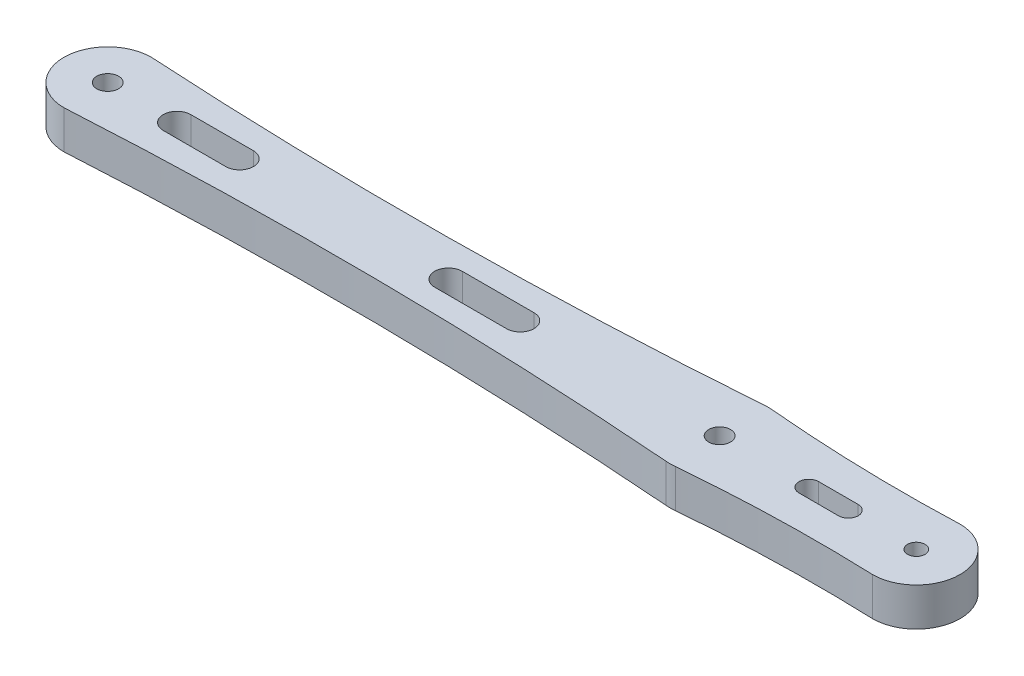
ISO-10303-21;
HEADER;
FILE_DESCRIPTION(('STEP AP214'),'2;1');
FILE_NAME('part.step','',(''),(''),'','','');
FILE_SCHEMA(('AUTOMOTIVE_DESIGN { 1 0 10303 214 1 1 1 1 }'));
ENDSEC;
DATA;
#1=APPLICATION_CONTEXT('core data for automotive mechanical design processes');
#2=APPLICATION_PROTOCOL_DEFINITION('international standard','automotive_design',2000,#1);
#3=PRODUCT_CONTEXT('',#1,'mechanical');
#4=PRODUCT('Part','Part','',(#3));
#5=PRODUCT_RELATED_PRODUCT_CATEGORY('part','',(#4));
#6=PRODUCT_DEFINITION_FORMATION('','',#4);
#7=PRODUCT_DEFINITION_CONTEXT('part definition',#1,'design');
#8=PRODUCT_DEFINITION('design','',#6,#7);
#9=PRODUCT_DEFINITION_SHAPE('','',#8);
#10=(LENGTH_UNIT() NAMED_UNIT(*) SI_UNIT(.MILLI.,.METRE.));
#11=(NAMED_UNIT(*) PLANE_ANGLE_UNIT() SI_UNIT($,.RADIAN.));
#12=(NAMED_UNIT(*) SI_UNIT($,.STERADIAN.) SOLID_ANGLE_UNIT());
#13=UNCERTAINTY_MEASURE_WITH_UNIT(LENGTH_MEASURE(1.E-05),#10,'distance_accuracy_value','');
#14=(GEOMETRIC_REPRESENTATION_CONTEXT(3) GLOBAL_UNCERTAINTY_ASSIGNED_CONTEXT((#13)) GLOBAL_UNIT_ASSIGNED_CONTEXT((#10,
#11,#12)) REPRESENTATION_CONTEXT('',''));
#15=CARTESIAN_POINT('',(0.,0.,0.));
#16=DIRECTION('',(0.,0.,1.));
#17=DIRECTION('',(1.,0.,0.));
#18=AXIS2_PLACEMENT_3D('',#15,#16,#17);
#19=CARTESIAN_POINT('',(36.,7.,0.));
#20=DIRECTION('',(0.,-1.,0.));
#21=DIRECTION('',(0.,0.,-1.));
#22=AXIS2_PLACEMENT_3D('',#19,#20,#21);
#23=CYLINDRICAL_SURFACE('',#22,8.);
#24=CARTESIAN_POINT('',(36.,0.,0.));
#25=DIRECTION('',(0.,1.,0.));
#26=DIRECTION('',(0.,0.,1.));
#27=AXIS2_PLACEMENT_3D('',#24,#25,#26);
#28=CIRCLE('',#27,8.);
#29=CARTESIAN_POINT('',(35.9999999999993,0.,8.));
#30=VERTEX_POINT('',#29);
#31=CARTESIAN_POINT('',(35.9999999999993,0.,-8.));
#32=VERTEX_POINT('',#31);
#33=EDGE_CURVE('E225',#30,#32,#28,.T.);
#34=ORIENTED_EDGE('',*,*,#33,.T.);
#35=DIRECTION('',(0.,-1.,0.));
#36=VECTOR('',#35,1.);
#37=CARTESIAN_POINT('',(35.9999999999993,7.,-8.));
#38=LINE('',#37,#36);
#39=CARTESIAN_POINT('',(35.9999999999993,7.,-8.));
#40=VERTEX_POINT('',#39);
#41=EDGE_CURVE('E392',#40,#32,#38,.T.);
#42=ORIENTED_EDGE('',*,*,#41,.F.);
#43=CARTESIAN_POINT('',(36.,7.,0.));
#44=DIRECTION('',(0.,1.,0.));
#45=DIRECTION('',(0.,0.,1.));
#46=AXIS2_PLACEMENT_3D('',#43,#44,#45);
#47=CIRCLE('',#46,8.);
#48=CARTESIAN_POINT('',(35.9999999999993,7.,8.));
#49=VERTEX_POINT('',#48);
#50=EDGE_CURVE('E316',#49,#40,#47,.T.);
#51=ORIENTED_EDGE('',*,*,#50,.F.);
#52=DIRECTION('',(0.,-1.,0.));
#53=VECTOR('',#52,1.);
#54=CARTESIAN_POINT('',(35.9999999999993,7.,8.));
#55=LINE('',#54,#53);
#56=EDGE_CURVE('E350',#49,#30,#55,.T.);
#57=ORIENTED_EDGE('',*,*,#56,.T.);
#58=EDGE_LOOP('',(#34,#42,#51,#57));
#59=FACE_BOUND('',#58,.T.);
#60=ADVANCED_FACE('F41',(#59),#23,.T.);
#61=CARTESIAN_POINT('',(25.6436822100264,7.,-283.672559560951));
#62=DIRECTION('',(0.,-1.,0.));
#63=DIRECTION('',(0.,0.,-1.));
#64=AXIS2_PLACEMENT_3D('',#61,#62,#63);
#65=CYLINDRICAL_SURFACE('',#64,275.867021249466);
#66=CARTESIAN_POINT('',(25.6436822100264,0.,-283.672559560951));
#67=DIRECTION('',(0.,1.,0.));
#68=DIRECTION('',(0.,0.,1.));
#69=AXIS2_PLACEMENT_3D('',#66,#67,#68);
#70=CIRCLE('',#69,275.867021249466);
#71=CARTESIAN_POINT('',(0.822811591801538,0.,-8.92442436290031));
#72=VERTEX_POINT('',#71);
#73=EDGE_CURVE('E354',#72,#32,#70,.T.);
#74=ORIENTED_EDGE('',*,*,#73,.F.);
#75=DIRECTION('',(0.,-1.,0.));
#76=VECTOR('',#75,1.);
#77=CARTESIAN_POINT('',(0.822811591801538,7.,-8.92442436290031));
#78=LINE('',#77,#76);
#79=CARTESIAN_POINT('',(0.822811591801538,7.,-8.92442436290031));
#80=VERTEX_POINT('',#79);
#81=EDGE_CURVE('E11',#72,#80,#78,.F.);
#82=ORIENTED_EDGE('',*,*,#81,.T.);
#83=CARTESIAN_POINT('',(25.6436822100264,7.,-283.672559560951));
#84=DIRECTION('',(0.,1.,0.));
#85=DIRECTION('',(0.,0.,1.));
#86=AXIS2_PLACEMENT_3D('',#83,#84,#85);
#87=CIRCLE('',#86,275.867021249466);
#88=EDGE_CURVE('E320',#80,#40,#87,.T.);
#89=ORIENTED_EDGE('',*,*,#88,.T.);
#90=ORIENTED_EDGE('',*,*,#41,.T.);
#91=EDGE_LOOP('',(#74,#82,#89,#90));
#92=FACE_BOUND('',#91,.T.);
#93=ADVANCED_FACE('F455',(#92),#65,.F.);
#94=CARTESIAN_POINT('',(-63.3603355622183,7.,-832.857582968458));
#95=DIRECTION('',(0.,-1.,0.));
#96=DIRECTION('',(0.,0.,-1.));
#97=AXIS2_PLACEMENT_3D('',#94,#95,#96);
#98=CYLINDRICAL_SURFACE('',#97,826.290414525781);
#99=CARTESIAN_POINT('',(-63.3603355622183,7.,-832.857582968458));
#100=DIRECTION('',(0.,1.,0.));
#101=DIRECTION('',(0.,0.,1.));
#102=AXIS2_PLACEMENT_3D('',#99,#100,#101);
#103=CIRCLE('',#102,826.290414525781);
#104=CARTESIAN_POINT('',(-111.999999999998,7.,-8.00000000000001));
#105=VERTEX_POINT('',#104);
#106=CARTESIAN_POINT('',(-0.833644493261315,7.,-8.93631121905491));
#107=VERTEX_POINT('',#106);
#108=EDGE_CURVE('E324',#105,#107,#103,.T.);
#109=ORIENTED_EDGE('',*,*,#108,.T.);
#110=DIRECTION('',(0.,-1.,0.));
#111=VECTOR('',#110,1.);
#112=CARTESIAN_POINT('',(-0.833644493261315,7.,-8.93631121905491));
#113=LINE('',#112,#111);
#114=CARTESIAN_POINT('',(-0.833644493261315,0.,-8.93631121905491));
#115=VERTEX_POINT('',#114);
#116=EDGE_CURVE('E50',#107,#115,#113,.T.);
#117=ORIENTED_EDGE('',*,*,#116,.T.);
#118=CARTESIAN_POINT('',(-63.3603355622183,0.,-832.857582968458));
#119=DIRECTION('',(0.,1.,0.));
#120=DIRECTION('',(0.,0.,1.));
#121=AXIS2_PLACEMENT_3D('',#118,#119,#120);
#122=CIRCLE('',#121,826.290414525781);
#123=CARTESIAN_POINT('',(-111.999999999998,0.,-8.00000000000001));
#124=VERTEX_POINT('',#123);
#125=EDGE_CURVE('E357',#124,#115,#122,.T.);
#126=ORIENTED_EDGE('',*,*,#125,.F.);
#127=DIRECTION('',(0.,-1.,0.));
#128=VECTOR('',#127,1.);
#129=CARTESIAN_POINT('',(-111.999999999998,7.,-8.00000000000001));
#130=LINE('',#129,#128);
#131=EDGE_CURVE('E389',#105,#124,#130,.T.);
#132=ORIENTED_EDGE('',*,*,#131,.F.);
#133=EDGE_LOOP('',(#109,#117,#126,#132));
#134=FACE_BOUND('',#133,.T.);
#135=ADVANCED_FACE('F419',(#134),#98,.F.);
#136=CARTESIAN_POINT('',(-112.,7.,0.));
#137=DIRECTION('',(0.,-1.,0.));
#138=DIRECTION('',(0.,0.,-1.));
#139=AXIS2_PLACEMENT_3D('',#136,#137,#138);
#140=CYLINDRICAL_SURFACE('',#139,8.00000000000001);
#141=CARTESIAN_POINT('',(-112.,0.,0.));
#142=DIRECTION('',(0.,1.,0.));
#143=DIRECTION('',(0.,0.,1.));
#144=AXIS2_PLACEMENT_3D('',#141,#142,#143);
#145=CIRCLE('',#144,8.00000000000001);
#146=CARTESIAN_POINT('',(-111.999999999998,0.,8.00000000000001));
#147=VERTEX_POINT('',#146);
#148=EDGE_CURVE('E361',#124,#147,#145,.T.);
#149=ORIENTED_EDGE('',*,*,#148,.T.);
#150=DIRECTION('',(0.,-1.,0.));
#151=VECTOR('',#150,1.);
#152=CARTESIAN_POINT('',(-111.999999999998,7.,8.00000000000001));
#153=LINE('',#152,#151);
#154=CARTESIAN_POINT('',(-111.999999999998,7.,8.00000000000001));
#155=VERTEX_POINT('',#154);
#156=EDGE_CURVE('E385',#155,#147,#153,.T.);
#157=ORIENTED_EDGE('',*,*,#156,.F.);
#158=CARTESIAN_POINT('',(-112.,7.,0.));
#159=DIRECTION('',(0.,1.,0.));
#160=DIRECTION('',(0.,0.,1.));
#161=AXIS2_PLACEMENT_3D('',#158,#159,#160);
#162=CIRCLE('',#161,8.00000000000001);
#163=EDGE_CURVE('E328',#105,#155,#162,.T.);
#164=ORIENTED_EDGE('',*,*,#163,.F.);
#165=ORIENTED_EDGE('',*,*,#131,.T.);
#166=EDGE_LOOP('',(#149,#157,#164,#165));
#167=FACE_BOUND('',#166,.T.);
#168=ADVANCED_FACE('F431',(#167),#140,.T.);
#169=CARTESIAN_POINT('',(-63.3603355622183,7.,832.857582968458));
#170=DIRECTION('',(0.,-1.,0.));
#171=DIRECTION('',(0.,0.,-1.));
#172=AXIS2_PLACEMENT_3D('',#169,#170,#171);
#173=CYLINDRICAL_SURFACE('',#172,826.290414525781);
#174=CARTESIAN_POINT('',(-63.3603355622183,0.,832.857582968458));
#175=DIRECTION('',(0.,1.,0.));
#176=DIRECTION('',(0.,0.,1.));
#177=AXIS2_PLACEMENT_3D('',#174,#175,#176);
#178=CIRCLE('',#177,826.290414525781);
#179=CARTESIAN_POINT('',(-0.833644493261787,0.,8.93631121905491));
#180=VERTEX_POINT('',#179);
#181=EDGE_CURVE('E364',#147,#180,#178,.F.);
#182=ORIENTED_EDGE('',*,*,#181,.T.);
#183=DIRECTION('',(0.,-1.,0.));
#184=VECTOR('',#183,1.);
#185=CARTESIAN_POINT('',(-0.833644493261787,7.,8.93631121905491));
#186=LINE('',#185,#184);
#187=CARTESIAN_POINT('',(-0.833644493261787,7.,8.93631121905491));
#188=VERTEX_POINT('',#187);
#189=EDGE_CURVE('E406',#180,#188,#186,.F.);
#190=ORIENTED_EDGE('',*,*,#189,.T.);
#191=CARTESIAN_POINT('',(-63.3603355622183,7.,832.857582968458));
#192=DIRECTION('',(0.,1.,0.));
#193=DIRECTION('',(0.,0.,1.));
#194=AXIS2_PLACEMENT_3D('',#191,#192,#193);
#195=CIRCLE('',#194,826.290414525781);
#196=EDGE_CURVE('E331',#155,#188,#195,.F.);
#197=ORIENTED_EDGE('',*,*,#196,.F.);
#198=ORIENTED_EDGE('',*,*,#156,.T.);
#199=EDGE_LOOP('',(#182,#190,#197,#198));
#200=FACE_BOUND('',#199,.T.);
#201=ADVANCED_FACE('F435',(#200),#173,.F.);
#202=CARTESIAN_POINT('',(-112.,7.,0.));
#203=DIRECTION('',(0.,-1.,0.));
#204=DIRECTION('',(0.,0.,-1.));
#205=AXIS2_PLACEMENT_3D('',#202,#203,#204);
#206=CYLINDRICAL_SURFACE('',#205,2.);
#207=CARTESIAN_POINT('',(-112.,7.,0.));
#208=DIRECTION('',(0.,1.,0.));
#209=DIRECTION('',(0.,0.,1.));
#210=AXIS2_PLACEMENT_3D('',#207,#208,#209);
#211=CIRCLE('',#210,2.);
#212=CARTESIAN_POINT('',(-112.,7.,2.));
#213=VERTEX_POINT('',#212);
#214=EDGE_CURVE('E342',#213,#213,#211,.T.);
#215=ORIENTED_EDGE('',*,*,#214,.T.);
#216=EDGE_LOOP('',(#215));
#217=FACE_BOUND('',#216,.T.);
#218=CARTESIAN_POINT('',(-112.,0.,0.));
#219=DIRECTION('',(0.,1.,0.));
#220=DIRECTION('',(0.,0.,1.));
#221=AXIS2_PLACEMENT_3D('',#218,#219,#220);
#222=CIRCLE('',#221,2.);
#223=CARTESIAN_POINT('',(-112.,0.,2.));
#224=VERTEX_POINT('',#223);
#225=EDGE_CURVE('E375',#224,#224,#222,.T.);
#226=ORIENTED_EDGE('',*,*,#225,.F.);
#227=EDGE_LOOP('',(#226));
#228=FACE_BOUND('',#227,.T.);
#229=ADVANCED_FACE('F483',(#217,#228),#206,.F.);
#230=CARTESIAN_POINT('',(0.,7.,0.));
#231=DIRECTION('',(0.,-1.,0.));
#232=DIRECTION('',(0.,0.,-1.));
#233=AXIS2_PLACEMENT_3D('',#230,#231,#232);
#234=CYLINDRICAL_SURFACE('',#233,2.);
#235=CARTESIAN_POINT('',(0.,7.,0.));
#236=DIRECTION('',(0.,1.,0.));
#237=DIRECTION('',(0.,0.,1.));
#238=AXIS2_PLACEMENT_3D('',#235,#236,#237);
#239=CIRCLE('',#238,2.);
#240=CARTESIAN_POINT('',(0.,7.,2.));
#241=VERTEX_POINT('',#240);
#242=EDGE_CURVE('E338',#241,#241,#239,.T.);
#243=ORIENTED_EDGE('',*,*,#242,.T.);
#244=EDGE_LOOP('',(#243));
#245=FACE_BOUND('',#244,.T.);
#246=CARTESIAN_POINT('',(0.,0.,0.));
#247=DIRECTION('',(0.,1.,0.));
#248=DIRECTION('',(0.,0.,1.));
#249=AXIS2_PLACEMENT_3D('',#246,#247,#248);
#250=CIRCLE('',#249,2.);
#251=CARTESIAN_POINT('',(0.,0.,2.));
#252=VERTEX_POINT('',#251);
#253=EDGE_CURVE('E371',#252,#252,#250,.T.);
#254=ORIENTED_EDGE('',*,*,#253,.F.);
#255=EDGE_LOOP('',(#254));
#256=FACE_BOUND('',#255,.T.);
#257=ADVANCED_FACE('F486',(#245,#256),#234,.F.);
#258=CARTESIAN_POINT('',(25.6436822100264,7.,283.672559560951));
#259=DIRECTION('',(0.,-1.,0.));
#260=DIRECTION('',(0.,0.,-1.));
#261=AXIS2_PLACEMENT_3D('',#258,#259,#260);
#262=CYLINDRICAL_SURFACE('',#261,275.867021249466);
#263=CARTESIAN_POINT('',(25.6436822100264,7.,283.672559560951));
#264=DIRECTION('',(0.,1.,0.));
#265=DIRECTION('',(0.,0.,1.));
#266=AXIS2_PLACEMENT_3D('',#263,#264,#265);
#267=CIRCLE('',#266,275.867021249466);
#268=CARTESIAN_POINT('',(0.822811591801097,7.,8.92442436290036));
#269=VERTEX_POINT('',#268);
#270=EDGE_CURVE('E335',#269,#49,#267,.F.);
#271=ORIENTED_EDGE('',*,*,#270,.F.);
#272=DIRECTION('',(0.,-1.,0.));
#273=VECTOR('',#272,1.);
#274=CARTESIAN_POINT('',(0.822811591801097,7.,8.92442436290036));
#275=LINE('',#274,#273);
#276=CARTESIAN_POINT('',(0.822811591801097,0.,8.92442436290036));
#277=VERTEX_POINT('',#276);
#278=EDGE_CURVE('E396',#269,#277,#275,.T.);
#279=ORIENTED_EDGE('',*,*,#278,.T.);
#280=CARTESIAN_POINT('',(25.6436822100264,0.,283.672559560951));
#281=DIRECTION('',(0.,1.,0.));
#282=DIRECTION('',(0.,0.,1.));
#283=AXIS2_PLACEMENT_3D('',#280,#281,#282);
#284=CIRCLE('',#283,275.867021249466);
#285=EDGE_CURVE('E368',#277,#30,#284,.F.);
#286=ORIENTED_EDGE('',*,*,#285,.T.);
#287=ORIENTED_EDGE('',*,*,#56,.F.);
#288=EDGE_LOOP('',(#271,#279,#286,#287));
#289=FACE_BOUND('',#288,.T.);
#290=ADVANCED_FACE('F446',(#289),#262,.F.);
#291=CARTESIAN_POINT('',(36.,7.,0.));
#292=DIRECTION('',(0.,-1.,0.));
#293=DIRECTION('',(0.,0.,-1.));
#294=AXIS2_PLACEMENT_3D('',#291,#292,#293);
#295=CYLINDRICAL_SURFACE('',#294,1.60000000000001);
#296=CARTESIAN_POINT('',(36.,7.,0.));
#297=DIRECTION('',(0.,1.,0.));
#298=DIRECTION('',(0.,0.,1.));
#299=AXIS2_PLACEMENT_3D('',#296,#297,#298);
#300=CIRCLE('',#299,1.60000000000001);
#301=CARTESIAN_POINT('',(36.,7.,1.60000000000001));
#302=VERTEX_POINT('',#301);
#303=EDGE_CURVE('E346',#302,#302,#300,.T.);
#304=ORIENTED_EDGE('',*,*,#303,.T.);
#305=EDGE_LOOP('',(#304));
#306=FACE_BOUND('',#305,.T.);
#307=CARTESIAN_POINT('',(36.,0.,0.));
#308=DIRECTION('',(0.,1.,0.));
#309=DIRECTION('',(0.,0.,1.));
#310=AXIS2_PLACEMENT_3D('',#307,#308,#309);
#311=CIRCLE('',#310,1.60000000000001);
#312=CARTESIAN_POINT('',(36.,0.,1.60000000000001));
#313=VERTEX_POINT('',#312);
#314=EDGE_CURVE('E321',#313,#313,#311,.T.);
#315=ORIENTED_EDGE('',*,*,#314,.F.);
#316=EDGE_LOOP('',(#315));
#317=FACE_BOUND('',#316,.T.);
#318=ADVANCED_FACE('F475',(#306,#317),#295,.F.);
#319=CARTESIAN_POINT('',(0.,7.,0.));
#320=DIRECTION('',(0.,1.,0.));
#321=DIRECTION('',(0.,0.,1.));
#322=AXIS2_PLACEMENT_3D('',#319,#320,#321);
#323=PLANE('',#322);
#324=CARTESIAN_POINT('',(-99.3093444942737,7.,0.));
#325=DIRECTION('',(0.,1.,0.));
#326=DIRECTION('',(0.,0.,1.));
#327=AXIS2_PLACEMENT_3D('',#324,#325,#326);
#328=CIRCLE('',#327,2.5242465906269);
#329=CARTESIAN_POINT('',(-99.3093444942737,7.,-2.5242465906269));
#330=VERTEX_POINT('',#329);
#331=CARTESIAN_POINT('',(-99.3093444942737,7.,2.5242465906269));
#332=VERTEX_POINT('',#331);
#333=EDGE_CURVE('E57',#330,#332,#328,.T.);
#334=ORIENTED_EDGE('',*,*,#333,.F.);
#335=DIRECTION('',(-1.,0.,0.));
#336=VECTOR('',#335,1.);
#337=CARTESIAN_POINT('',(-99.3093444942737,7.,-2.5242465906269));
#338=LINE('',#337,#336);
#339=CARTESIAN_POINT('',(-87.8540345235266,7.,-2.5242465906269));
#340=VERTEX_POINT('',#339);
#341=EDGE_CURVE('E202',#340,#330,#338,.T.);
#342=ORIENTED_EDGE('',*,*,#341,.F.);
#343=CARTESIAN_POINT('',(-87.8540345235266,7.,0.));
#344=DIRECTION('',(0.,1.,0.));
#345=DIRECTION('',(0.,0.,1.));
#346=AXIS2_PLACEMENT_3D('',#343,#344,#345);
#347=CIRCLE('',#346,2.5242465906269);
#348=CARTESIAN_POINT('',(-87.8540345235266,7.,2.5242465906269));
#349=VERTEX_POINT('',#348);
#350=EDGE_CURVE('E206',#349,#340,#347,.T.);
#351=ORIENTED_EDGE('',*,*,#350,.F.);
#352=DIRECTION('',(1.,0.,0.));
#353=VECTOR('',#352,1.);
#354=CARTESIAN_POINT('',(-99.3093444942737,7.,2.5242465906269));
#355=LINE('',#354,#353);
#356=EDGE_CURVE('E215',#332,#349,#355,.T.);
#357=ORIENTED_EDGE('',*,*,#356,.F.);
#358=EDGE_LOOP('',(#334,#342,#351,#357));
#359=FACE_BOUND('',#358,.T.);
#360=CARTESIAN_POINT('',(-49.6294738842967,7.,0.));
#361=DIRECTION('',(0.,1.,0.));
#362=DIRECTION('',(0.,0.,1.));
#363=AXIS2_PLACEMENT_3D('',#360,#361,#362);
#364=CIRCLE('',#363,2.5242465906269);
#365=CARTESIAN_POINT('',(-49.6294738842967,7.,-2.5242465906269));
#366=VERTEX_POINT('',#365);
#367=CARTESIAN_POINT('',(-49.6294738842967,7.,2.5242465906269));
#368=VERTEX_POINT('',#367);
#369=EDGE_CURVE('E65',#366,#368,#364,.T.);
#370=ORIENTED_EDGE('',*,*,#369,.F.);
#371=DIRECTION('',(-1.,0.,0.));
#372=VECTOR('',#371,1.);
#373=CARTESIAN_POINT('',(-49.6294738842967,7.,-2.5242465906269));
#374=LINE('',#373,#372);
#375=CARTESIAN_POINT('',(-36.4860129704921,7.,-2.5242465906269));
#376=VERTEX_POINT('',#375);
#377=EDGE_CURVE('E236',#376,#366,#374,.T.);
#378=ORIENTED_EDGE('',*,*,#377,.F.);
#379=CARTESIAN_POINT('',(-36.4860129704921,7.,0.));
#380=DIRECTION('',(0.,1.,0.));
#381=DIRECTION('',(0.,0.,1.));
#382=AXIS2_PLACEMENT_3D('',#379,#380,#381);
#383=CIRCLE('',#382,2.5242465906269);
#384=CARTESIAN_POINT('',(-36.4860129704921,7.,2.5242465906269));
#385=VERTEX_POINT('',#384);
#386=EDGE_CURVE('E256',#385,#376,#383,.T.);
#387=ORIENTED_EDGE('',*,*,#386,.F.);
#388=DIRECTION('',(1.,0.,0.));
#389=VECTOR('',#388,1.);
#390=CARTESIAN_POINT('',(-49.6294738842967,7.,2.5242465906269));
#391=LINE('',#390,#389);
#392=EDGE_CURVE('E251',#368,#385,#391,.T.);
#393=ORIENTED_EDGE('',*,*,#392,.F.);
#394=EDGE_LOOP('',(#370,#378,#387,#393));
#395=FACE_BOUND('',#394,.T.);
#396=CARTESIAN_POINT('',(16.3289951051631,7.,0.));
#397=DIRECTION('',(0.,1.,0.));
#398=DIRECTION('',(0.,0.,1.));
#399=AXIS2_PLACEMENT_3D('',#396,#397,#398);
#400=CIRCLE('',#399,1.80075332931656);
#401=CARTESIAN_POINT('',(16.3289951051631,7.,-1.80075332931656));
#402=VERTEX_POINT('',#401);
#403=CARTESIAN_POINT('',(16.3289951051631,7.,1.80075332931656));
#404=VERTEX_POINT('',#403);
#405=EDGE_CURVE('E291',#402,#404,#400,.T.);
#406=ORIENTED_EDGE('',*,*,#405,.F.);
#407=DIRECTION('',(-1.,0.,0.));
#408=VECTOR('',#407,1.);
#409=CARTESIAN_POINT('',(16.3289951051631,7.,-1.80075332931656));
#410=LINE('',#409,#408);
#411=CARTESIAN_POINT('',(23.5639277182665,7.,-1.80075332931656));
#412=VERTEX_POINT('',#411);
#413=EDGE_CURVE('E278',#412,#402,#410,.T.);
#414=ORIENTED_EDGE('',*,*,#413,.F.);
#415=CARTESIAN_POINT('',(23.5639277182665,7.,0.));
#416=DIRECTION('',(0.,1.,0.));
#417=DIRECTION('',(0.,0.,1.));
#418=AXIS2_PLACEMENT_3D('',#415,#416,#417);
#419=CIRCLE('',#418,1.80075332931656);
#420=CARTESIAN_POINT('',(23.5639277182665,7.,1.80075332931656));
#421=VERTEX_POINT('',#420);
#422=EDGE_CURVE('E298',#421,#412,#419,.T.);
#423=ORIENTED_EDGE('',*,*,#422,.F.);
#424=DIRECTION('',(1.,0.,0.));
#425=VECTOR('',#424,1.);
#426=CARTESIAN_POINT('',(16.3289951051631,7.,1.80075332931656));
#427=LINE('',#426,#425);
#428=EDGE_CURVE('E294',#404,#421,#427,.T.);
#429=ORIENTED_EDGE('',*,*,#428,.F.);
#430=EDGE_LOOP('',(#406,#414,#423,#429));
#431=FACE_BOUND('',#430,.T.);
#432=ORIENTED_EDGE('',*,*,#196,.T.);
#433=CARTESIAN_POINT('',(-0.0769288159434001,7.,-1.03501674585026));
#434=DIRECTION('',(0.,1.,0.));
#435=DIRECTION('',(0.,0.,1.));
#436=AXIS2_PLACEMENT_3D('',#433,#434,#435);
#437=CIRCLE('',#436,10.);
#438=EDGE_CURVE('E412',#188,#269,#437,.T.);
#439=ORIENTED_EDGE('',*,*,#438,.T.);
#440=ORIENTED_EDGE('',*,*,#270,.T.);
#441=ORIENTED_EDGE('',*,*,#50,.T.);
#442=ORIENTED_EDGE('',*,*,#88,.F.);
#443=CARTESIAN_POINT('',(-0.0769288159429282,7.,1.03501674585018));
#444=DIRECTION('',(0.,1.,0.));
#445=DIRECTION('',(0.,0.,1.));
#446=AXIS2_PLACEMENT_3D('',#443,#444,#445);
#447=CIRCLE('',#446,10.);
#448=EDGE_CURVE('E409',#80,#107,#447,.T.);
#449=ORIENTED_EDGE('',*,*,#448,.T.);
#450=ORIENTED_EDGE('',*,*,#108,.F.);
#451=ORIENTED_EDGE('',*,*,#163,.T.);
#452=EDGE_LOOP('',(#432,#439,#440,#441,#442,#449,#450,#451));
#453=FACE_BOUND('',#452,.T.);
#454=ORIENTED_EDGE('',*,*,#242,.F.);
#455=EDGE_LOOP('',(#454));
#456=FACE_BOUND('',#455,.T.);
#457=ORIENTED_EDGE('',*,*,#214,.F.);
#458=EDGE_LOOP('',(#457));
#459=FACE_BOUND('',#458,.T.);
#460=ORIENTED_EDGE('',*,*,#303,.F.);
#461=EDGE_LOOP('',(#460));
#462=FACE_BOUND('',#461,.T.);
#463=ADVANCED_FACE('F439',(#359,#395,#431,#453,#456,#459,#462),#323,.T.);
#464=CARTESIAN_POINT('',(0.,0.,0.));
#465=DIRECTION('',(0.,1.,0.));
#466=DIRECTION('',(0.,0.,1.));
#467=AXIS2_PLACEMENT_3D('',#464,#465,#466);
#468=PLANE('',#467);
#469=DIRECTION('',(-1.,0.,0.));
#470=VECTOR('',#469,1.);
#471=CARTESIAN_POINT('',(-99.3093444942737,0.,-2.5242465906269));
#472=LINE('',#471,#470);
#473=CARTESIAN_POINT('',(-87.8540345235266,0.,-2.5242465906269));
#474=VERTEX_POINT('',#473);
#475=CARTESIAN_POINT('',(-99.3093444942737,0.,-2.5242465906269));
#476=VERTEX_POINT('',#475);
#477=EDGE_CURVE('E187',#474,#476,#472,.T.);
#478=ORIENTED_EDGE('',*,*,#477,.T.);
#479=CARTESIAN_POINT('',(-99.3093444942737,0.,0.));
#480=DIRECTION('',(0.,1.,0.));
#481=DIRECTION('',(0.,0.,1.));
#482=AXIS2_PLACEMENT_3D('',#479,#480,#481);
#483=CIRCLE('',#482,2.5242465906269);
#484=CARTESIAN_POINT('',(-99.3093444942737,0.,2.5242465906269));
#485=VERTEX_POINT('',#484);
#486=EDGE_CURVE('E180',#476,#485,#483,.T.);
#487=ORIENTED_EDGE('',*,*,#486,.T.);
#488=DIRECTION('',(1.,0.,0.));
#489=VECTOR('',#488,1.);
#490=CARTESIAN_POINT('',(-99.3093444942737,0.,2.5242465906269));
#491=LINE('',#490,#489);
#492=CARTESIAN_POINT('',(-87.8540345235266,0.,2.5242465906269));
#493=VERTEX_POINT('',#492);
#494=EDGE_CURVE('E191',#485,#493,#491,.T.);
#495=ORIENTED_EDGE('',*,*,#494,.T.);
#496=CARTESIAN_POINT('',(-87.8540345235266,0.,0.));
#497=DIRECTION('',(0.,1.,0.));
#498=DIRECTION('',(0.,0.,1.));
#499=AXIS2_PLACEMENT_3D('',#496,#497,#498);
#500=CIRCLE('',#499,2.5242465906269);
#501=EDGE_CURVE('E196',#493,#474,#500,.T.);
#502=ORIENTED_EDGE('',*,*,#501,.T.);
#503=EDGE_LOOP('',(#478,#487,#495,#502));
#504=FACE_BOUND('',#503,.T.);
#505=DIRECTION('',(-1.,0.,0.));
#506=VECTOR('',#505,1.);
#507=CARTESIAN_POINT('',(-49.6294738842967,0.,-2.5242465906269));
#508=LINE('',#507,#506);
#509=CARTESIAN_POINT('',(-36.4860129704921,0.,-2.5242465906269));
#510=VERTEX_POINT('',#509);
#511=CARTESIAN_POINT('',(-49.6294738842967,0.,-2.5242465906269));
#512=VERTEX_POINT('',#511);
#513=EDGE_CURVE('E244',#510,#512,#508,.T.);
#514=ORIENTED_EDGE('',*,*,#513,.T.);
#515=CARTESIAN_POINT('',(-49.6294738842967,0.,0.));
#516=DIRECTION('',(0.,1.,0.));
#517=DIRECTION('',(0.,0.,1.));
#518=AXIS2_PLACEMENT_3D('',#515,#516,#517);
#519=CIRCLE('',#518,2.5242465906269);
#520=CARTESIAN_POINT('',(-49.6294738842967,0.,2.5242465906269));
#521=VERTEX_POINT('',#520);
#522=EDGE_CURVE('E231',#512,#521,#519,.T.);
#523=ORIENTED_EDGE('',*,*,#522,.T.);
#524=DIRECTION('',(1.,0.,0.));
#525=VECTOR('',#524,1.);
#526=CARTESIAN_POINT('',(-49.6294738842967,0.,2.5242465906269));
#527=LINE('',#526,#525);
#528=CARTESIAN_POINT('',(-36.4860129704921,0.,2.5242465906269));
#529=VERTEX_POINT('',#528);
#530=EDGE_CURVE('E235',#521,#529,#527,.T.);
#531=ORIENTED_EDGE('',*,*,#530,.T.);
#532=CARTESIAN_POINT('',(-36.4860129704921,0.,0.));
#533=DIRECTION('',(0.,1.,0.));
#534=DIRECTION('',(0.,0.,1.));
#535=AXIS2_PLACEMENT_3D('',#532,#533,#534);
#536=CIRCLE('',#535,2.5242465906269);
#537=EDGE_CURVE('E240',#529,#510,#536,.T.);
#538=ORIENTED_EDGE('',*,*,#537,.T.);
#539=EDGE_LOOP('',(#514,#523,#531,#538));
#540=FACE_BOUND('',#539,.T.);
#541=DIRECTION('',(-1.,0.,0.));
#542=VECTOR('',#541,1.);
#543=CARTESIAN_POINT('',(16.3289951051631,0.,-1.80075332931656));
#544=LINE('',#543,#542);
#545=CARTESIAN_POINT('',(23.5639277182665,0.,-1.80075332931656));
#546=VERTEX_POINT('',#545);
#547=CARTESIAN_POINT('',(16.3289951051631,0.,-1.80075332931656));
#548=VERTEX_POINT('',#547);
#549=EDGE_CURVE('E286',#546,#548,#544,.T.);
#550=ORIENTED_EDGE('',*,*,#549,.T.);
#551=CARTESIAN_POINT('',(16.3289951051631,0.,0.));
#552=DIRECTION('',(0.,1.,0.));
#553=DIRECTION('',(0.,0.,1.));
#554=AXIS2_PLACEMENT_3D('',#551,#552,#553);
#555=CIRCLE('',#554,1.80075332931656);
#556=CARTESIAN_POINT('',(16.3289951051631,0.,1.80075332931656));
#557=VERTEX_POINT('',#556);
#558=EDGE_CURVE('E273',#548,#557,#555,.T.);
#559=ORIENTED_EDGE('',*,*,#558,.T.);
#560=DIRECTION('',(1.,0.,0.));
#561=VECTOR('',#560,1.);
#562=CARTESIAN_POINT('',(16.3289951051631,0.,1.80075332931656));
#563=LINE('',#562,#561);
#564=CARTESIAN_POINT('',(23.5639277182665,0.,1.80075332931656));
#565=VERTEX_POINT('',#564);
#566=EDGE_CURVE('E277',#557,#565,#563,.T.);
#567=ORIENTED_EDGE('',*,*,#566,.T.);
#568=CARTESIAN_POINT('',(23.5639277182665,0.,0.));
#569=DIRECTION('',(0.,1.,0.));
#570=DIRECTION('',(0.,0.,1.));
#571=AXIS2_PLACEMENT_3D('',#568,#569,#570);
#572=CIRCLE('',#571,1.80075332931656);
#573=EDGE_CURVE('E282',#565,#546,#572,.T.);
#574=ORIENTED_EDGE('',*,*,#573,.T.);
#575=EDGE_LOOP('',(#550,#559,#567,#574));
#576=FACE_BOUND('',#575,.T.);
#577=ORIENTED_EDGE('',*,*,#285,.F.);
#578=CARTESIAN_POINT('',(-0.0769288159434001,0.,-1.03501674585026));
#579=DIRECTION('',(0.,1.,0.));
#580=DIRECTION('',(0.,0.,1.));
#581=AXIS2_PLACEMENT_3D('',#578,#579,#580);
#582=CIRCLE('',#581,10.);
#583=EDGE_CURVE('E403',#277,#180,#582,.F.);
#584=ORIENTED_EDGE('',*,*,#583,.T.);
#585=ORIENTED_EDGE('',*,*,#181,.F.);
#586=ORIENTED_EDGE('',*,*,#148,.F.);
#587=ORIENTED_EDGE('',*,*,#125,.T.);
#588=CARTESIAN_POINT('',(-0.0769288159429282,0.,1.03501674585018));
#589=DIRECTION('',(0.,1.,0.));
#590=DIRECTION('',(0.,0.,1.));
#591=AXIS2_PLACEMENT_3D('',#588,#589,#590);
#592=CIRCLE('',#591,10.);
#593=EDGE_CURVE('E400',#115,#72,#592,.F.);
#594=ORIENTED_EDGE('',*,*,#593,.T.);
#595=ORIENTED_EDGE('',*,*,#73,.T.);
#596=ORIENTED_EDGE('',*,*,#33,.F.);
#597=EDGE_LOOP('',(#577,#584,#585,#586,#587,#594,#595,#596));
#598=FACE_BOUND('',#597,.T.);
#599=ORIENTED_EDGE('',*,*,#253,.T.);
#600=EDGE_LOOP('',(#599));
#601=FACE_BOUND('',#600,.T.);
#602=ORIENTED_EDGE('',*,*,#225,.T.);
#603=EDGE_LOOP('',(#602));
#604=FACE_BOUND('',#603,.T.);
#605=ORIENTED_EDGE('',*,*,#314,.T.);
#606=EDGE_LOOP('',(#605));
#607=FACE_BOUND('',#606,.T.);
#608=ADVANCED_FACE('F198',(#504,#540,#576,#598,#601,#604,#607),#468,.F.);
#609=CARTESIAN_POINT('',(-0.0769288159434001,7.,-1.03501674585026));
#610=DIRECTION('',(0.,-1.,0.));
#611=DIRECTION('',(0.,0.,-1.));
#612=AXIS2_PLACEMENT_3D('',#609,#610,#611);
#613=CYLINDRICAL_SURFACE('',#612,10.);
#614=ORIENTED_EDGE('',*,*,#438,.F.);
#615=ORIENTED_EDGE('',*,*,#189,.F.);
#616=ORIENTED_EDGE('',*,*,#583,.F.);
#617=ORIENTED_EDGE('',*,*,#278,.F.);
#618=EDGE_LOOP('',(#614,#615,#616,#617));
#619=FACE_BOUND('',#618,.T.);
#620=ADVANCED_FACE('F444',(#619),#613,.T.);
#621=CARTESIAN_POINT('',(-0.0769288159429282,7.,1.03501674585018));
#622=DIRECTION('',(0.,-1.,0.));
#623=DIRECTION('',(0.,0.,-1.));
#624=AXIS2_PLACEMENT_3D('',#621,#622,#623);
#625=CYLINDRICAL_SURFACE('',#624,10.);
#626=ORIENTED_EDGE('',*,*,#448,.F.);
#627=ORIENTED_EDGE('',*,*,#81,.F.);
#628=ORIENTED_EDGE('',*,*,#593,.F.);
#629=ORIENTED_EDGE('',*,*,#116,.F.);
#630=EDGE_LOOP('',(#626,#627,#628,#629));
#631=FACE_BOUND('',#630,.T.);
#632=ADVANCED_FACE('F43',(#631),#625,.T.);
#633=CARTESIAN_POINT('',(16.3289951051631,0.,0.));
#634=DIRECTION('',(0.,1.,0.));
#635=DIRECTION('',(0.,0.,1.));
#636=AXIS2_PLACEMENT_3D('',#633,#634,#635);
#637=CYLINDRICAL_SURFACE('',#636,1.80075332931656);
#638=ORIENTED_EDGE('',*,*,#405,.T.);
#639=DIRECTION('',(0.,1.,0.));
#640=VECTOR('',#639,1.);
#641=CARTESIAN_POINT('',(16.3289951051631,0.,1.80075332931656));
#642=LINE('',#641,#640);
#643=EDGE_CURVE('E290',#557,#404,#642,.T.);
#644=ORIENTED_EDGE('',*,*,#643,.F.);
#645=ORIENTED_EDGE('',*,*,#558,.F.);
#646=DIRECTION('',(0.,1.,0.));
#647=VECTOR('',#646,1.);
#648=CARTESIAN_POINT('',(16.3289951051631,0.,-1.80075332931656));
#649=LINE('',#648,#647);
#650=EDGE_CURVE('E252',#548,#402,#649,.T.);
#651=ORIENTED_EDGE('',*,*,#650,.T.);
#652=EDGE_LOOP('',(#638,#644,#645,#651));
#653=FACE_BOUND('',#652,.T.);
#654=ADVANCED_FACE('F470',(#653),#637,.F.);
#655=CARTESIAN_POINT('',(16.3289951051631,0.,-1.80075332931656));
#656=DIRECTION('',(0.,0.,-1.));
#657=DIRECTION('',(-1.,0.,0.));
#658=AXIS2_PLACEMENT_3D('',#655,#656,#657);
#659=PLANE('',#658);
#660=ORIENTED_EDGE('',*,*,#413,.T.);
#661=ORIENTED_EDGE('',*,*,#650,.F.);
#662=ORIENTED_EDGE('',*,*,#549,.F.);
#663=DIRECTION('',(0.,1.,0.));
#664=VECTOR('',#663,1.);
#665=CARTESIAN_POINT('',(23.5639277182665,0.,-1.80075332931656));
#666=LINE('',#665,#664);
#667=EDGE_CURVE('E307',#546,#412,#666,.T.);
#668=ORIENTED_EDGE('',*,*,#667,.T.);
#669=EDGE_LOOP('',(#660,#661,#662,#668));
#670=FACE_BOUND('',#669,.T.);
#671=ADVANCED_FACE('F544',(#670),#659,.F.);
#672=CARTESIAN_POINT('',(23.5639277182665,0.,0.));
#673=DIRECTION('',(0.,1.,0.));
#674=DIRECTION('',(0.,0.,1.));
#675=AXIS2_PLACEMENT_3D('',#672,#673,#674);
#676=CYLINDRICAL_SURFACE('',#675,1.80075332931656);
#677=ORIENTED_EDGE('',*,*,#422,.T.);
#678=ORIENTED_EDGE('',*,*,#667,.F.);
#679=ORIENTED_EDGE('',*,*,#573,.F.);
#680=DIRECTION('',(0.,1.,0.));
#681=VECTOR('',#680,1.);
#682=CARTESIAN_POINT('',(23.5639277182665,0.,1.80075332931656));
#683=LINE('',#682,#681);
#684=EDGE_CURVE('E310',#565,#421,#683,.T.);
#685=ORIENTED_EDGE('',*,*,#684,.T.);
#686=EDGE_LOOP('',(#677,#678,#679,#685));
#687=FACE_BOUND('',#686,.T.);
#688=ADVANCED_FACE('F553',(#687),#676,.F.);
#689=CARTESIAN_POINT('',(16.3289951051631,0.,1.80075332931656));
#690=DIRECTION('',(0.,0.,1.));
#691=DIRECTION('',(1.,0.,0.));
#692=AXIS2_PLACEMENT_3D('',#689,#690,#691);
#693=PLANE('',#692);
#694=ORIENTED_EDGE('',*,*,#428,.T.);
#695=ORIENTED_EDGE('',*,*,#684,.F.);
#696=ORIENTED_EDGE('',*,*,#566,.F.);
#697=ORIENTED_EDGE('',*,*,#643,.T.);
#698=EDGE_LOOP('',(#694,#695,#696,#697));
#699=FACE_BOUND('',#698,.T.);
#700=ADVANCED_FACE('F563',(#699),#693,.F.);
#701=CARTESIAN_POINT('',(-49.6294738842967,0.,0.));
#702=DIRECTION('',(0.,1.,0.));
#703=DIRECTION('',(0.,0.,1.));
#704=AXIS2_PLACEMENT_3D('',#701,#702,#703);
#705=CYLINDRICAL_SURFACE('',#704,2.5242465906269);
#706=ORIENTED_EDGE('',*,*,#369,.T.);
#707=DIRECTION('',(0.,1.,0.));
#708=VECTOR('',#707,1.);
#709=CARTESIAN_POINT('',(-49.6294738842967,0.,2.5242465906269));
#710=LINE('',#709,#708);
#711=EDGE_CURVE('E248',#521,#368,#710,.T.);
#712=ORIENTED_EDGE('',*,*,#711,.F.);
#713=ORIENTED_EDGE('',*,*,#522,.F.);
#714=DIRECTION('',(0.,1.,0.));
#715=VECTOR('',#714,1.);
#716=CARTESIAN_POINT('',(-49.6294738842967,0.,-2.5242465906269));
#717=LINE('',#716,#715);
#718=EDGE_CURVE('E216',#512,#366,#717,.T.);
#719=ORIENTED_EDGE('',*,*,#718,.T.);
#720=EDGE_LOOP('',(#706,#712,#713,#719));
#721=FACE_BOUND('',#720,.T.);
#722=ADVANCED_FACE('F573',(#721),#705,.F.);
#723=CARTESIAN_POINT('',(-49.6294738842967,0.,-2.5242465906269));
#724=DIRECTION('',(0.,0.,-1.));
#725=DIRECTION('',(-1.,0.,0.));
#726=AXIS2_PLACEMENT_3D('',#723,#724,#725);
#727=PLANE('',#726);
#728=ORIENTED_EDGE('',*,*,#377,.T.);
#729=ORIENTED_EDGE('',*,*,#718,.F.);
#730=ORIENTED_EDGE('',*,*,#513,.F.);
#731=DIRECTION('',(0.,1.,0.));
#732=VECTOR('',#731,1.);
#733=CARTESIAN_POINT('',(-36.4860129704921,0.,-2.5242465906269));
#734=LINE('',#733,#732);
#735=EDGE_CURVE('E265',#510,#376,#734,.T.);
#736=ORIENTED_EDGE('',*,*,#735,.T.);
#737=EDGE_LOOP('',(#728,#729,#730,#736));
#738=FACE_BOUND('',#737,.T.);
#739=ADVANCED_FACE('F583',(#738),#727,.F.);
#740=CARTESIAN_POINT('',(-36.4860129704921,0.,0.));
#741=DIRECTION('',(0.,1.,0.));
#742=DIRECTION('',(0.,0.,1.));
#743=AXIS2_PLACEMENT_3D('',#740,#741,#742);
#744=CYLINDRICAL_SURFACE('',#743,2.5242465906269);
#745=ORIENTED_EDGE('',*,*,#386,.T.);
#746=ORIENTED_EDGE('',*,*,#735,.F.);
#747=ORIENTED_EDGE('',*,*,#537,.F.);
#748=DIRECTION('',(0.,1.,0.));
#749=VECTOR('',#748,1.);
#750=CARTESIAN_POINT('',(-36.4860129704921,0.,2.5242465906269));
#751=LINE('',#750,#749);
#752=EDGE_CURVE('E268',#529,#385,#751,.T.);
#753=ORIENTED_EDGE('',*,*,#752,.T.);
#754=EDGE_LOOP('',(#745,#746,#747,#753));
#755=FACE_BOUND('',#754,.T.);
#756=ADVANCED_FACE('F592',(#755),#744,.F.);
#757=CARTESIAN_POINT('',(-49.6294738842967,0.,2.5242465906269));
#758=DIRECTION('',(0.,0.,1.));
#759=DIRECTION('',(1.,0.,0.));
#760=AXIS2_PLACEMENT_3D('',#757,#758,#759);
#761=PLANE('',#760);
#762=ORIENTED_EDGE('',*,*,#392,.T.);
#763=ORIENTED_EDGE('',*,*,#752,.F.);
#764=ORIENTED_EDGE('',*,*,#530,.F.);
#765=ORIENTED_EDGE('',*,*,#711,.T.);
#766=EDGE_LOOP('',(#762,#763,#764,#765));
#767=FACE_BOUND('',#766,.T.);
#768=ADVANCED_FACE('F602',(#767),#761,.F.);
#769=CARTESIAN_POINT('',(-99.3093444942737,0.,0.));
#770=DIRECTION('',(0.,1.,0.));
#771=DIRECTION('',(0.,0.,1.));
#772=AXIS2_PLACEMENT_3D('',#769,#770,#771);
#773=CYLINDRICAL_SURFACE('',#772,2.5242465906269);
#774=ORIENTED_EDGE('',*,*,#333,.T.);
#775=DIRECTION('',(0.,1.,0.));
#776=VECTOR('',#775,1.);
#777=CARTESIAN_POINT('',(-99.3093444942737,0.,2.5242465906269));
#778=LINE('',#777,#776);
#779=EDGE_CURVE('E176',#485,#332,#778,.T.);
#780=ORIENTED_EDGE('',*,*,#779,.F.);
#781=ORIENTED_EDGE('',*,*,#486,.F.);
#782=DIRECTION('',(0.,1.,0.));
#783=VECTOR('',#782,1.);
#784=CARTESIAN_POINT('',(-99.3093444942737,0.,-2.5242465906269));
#785=LINE('',#784,#783);
#786=EDGE_CURVE('E222',#476,#330,#785,.T.);
#787=ORIENTED_EDGE('',*,*,#786,.T.);
#788=EDGE_LOOP('',(#774,#780,#781,#787));
#789=FACE_BOUND('',#788,.T.);
#790=ADVANCED_FACE('F178',(#789),#773,.F.);
#791=CARTESIAN_POINT('',(-99.3093444942737,0.,-2.5242465906269));
#792=DIRECTION('',(0.,0.,-1.));
#793=DIRECTION('',(-1.,0.,0.));
#794=AXIS2_PLACEMENT_3D('',#791,#792,#793);
#795=PLANE('',#794);
#796=ORIENTED_EDGE('',*,*,#341,.T.);
#797=ORIENTED_EDGE('',*,*,#786,.F.);
#798=ORIENTED_EDGE('',*,*,#477,.F.);
#799=DIRECTION('',(0.,1.,0.));
#800=VECTOR('',#799,1.);
#801=CARTESIAN_POINT('',(-87.8540345235266,0.,-2.5242465906269));
#802=LINE('',#801,#800);
#803=EDGE_CURVE('E226',#474,#340,#802,.T.);
#804=ORIENTED_EDGE('',*,*,#803,.T.);
#805=EDGE_LOOP('',(#796,#797,#798,#804));
#806=FACE_BOUND('',#805,.T.);
#807=ADVANCED_FACE('F621',(#806),#795,.F.);
#808=CARTESIAN_POINT('',(-87.8540345235266,0.,0.));
#809=DIRECTION('',(0.,1.,0.));
#810=DIRECTION('',(0.,0.,1.));
#811=AXIS2_PLACEMENT_3D('',#808,#809,#810);
#812=CYLINDRICAL_SURFACE('',#811,2.5242465906269);
#813=ORIENTED_EDGE('',*,*,#350,.T.);
#814=ORIENTED_EDGE('',*,*,#803,.F.);
#815=ORIENTED_EDGE('',*,*,#501,.F.);
#816=DIRECTION('',(0.,1.,0.));
#817=VECTOR('',#816,1.);
#818=CARTESIAN_POINT('',(-87.8540345235266,0.,2.5242465906269));
#819=LINE('',#818,#817);
#820=EDGE_CURVE('E186',#493,#349,#819,.T.);
#821=ORIENTED_EDGE('',*,*,#820,.T.);
#822=EDGE_LOOP('',(#813,#814,#815,#821));
#823=FACE_BOUND('',#822,.T.);
#824=ADVANCED_FACE('F630',(#823),#812,.F.);
#825=CARTESIAN_POINT('',(-99.3093444942737,0.,2.5242465906269));
#826=DIRECTION('',(0.,0.,1.));
#827=DIRECTION('',(1.,0.,0.));
#828=AXIS2_PLACEMENT_3D('',#825,#826,#827);
#829=PLANE('',#828);
#830=ORIENTED_EDGE('',*,*,#356,.T.);
#831=ORIENTED_EDGE('',*,*,#820,.F.);
#832=ORIENTED_EDGE('',*,*,#494,.F.);
#833=ORIENTED_EDGE('',*,*,#779,.T.);
#834=EDGE_LOOP('',(#830,#831,#832,#833));
#835=FACE_BOUND('',#834,.T.);
#836=ADVANCED_FACE('F192',(#835),#829,.F.);
#837=CLOSED_SHELL('',(#60,#93,#135,#168,#201,#229,#257,#290,#318,#463,#608,#620,#632,#654,#671,
#688,#700,#722,#739,#756,#768,#790,#807,#824,#836));
#838=MANIFOLD_SOLID_BREP('B2',#837);
#839=ADVANCED_BREP_SHAPE_REPRESENTATION('',(#18,#838),#14);
#840=SHAPE_DEFINITION_REPRESENTATION(#9,#839);
ENDSEC;
END-ISO-10303-21;
